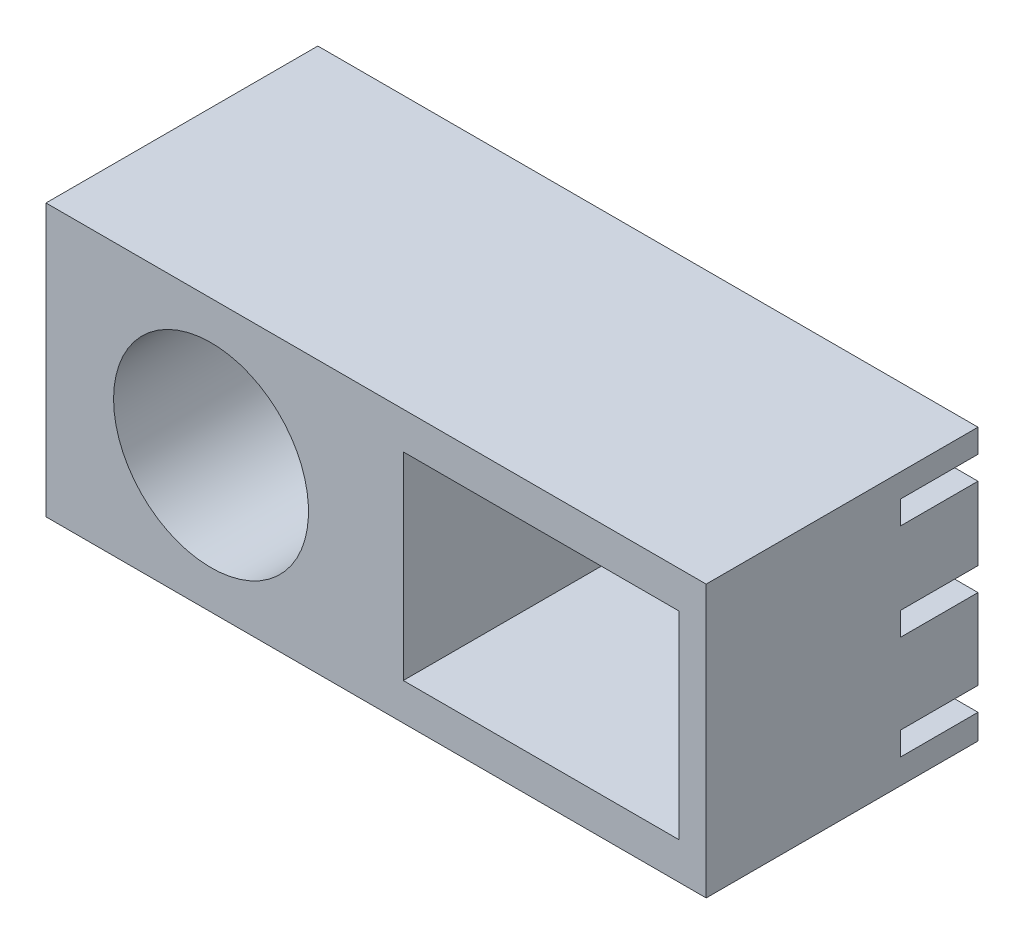
ISO-10303-21;
HEADER;
FILE_DESCRIPTION(('STEP AP214'),'2;1');
FILE_NAME('part.step','',(''),(''),'','','');
FILE_SCHEMA(('AUTOMOTIVE_DESIGN { 1 0 10303 214 1 1 1 1 }'));
ENDSEC;
DATA;
#1=APPLICATION_CONTEXT('core data for automotive mechanical design processes');
#2=APPLICATION_PROTOCOL_DEFINITION('international standard','automotive_design',2000,#1);
#3=PRODUCT_CONTEXT('',#1,'mechanical');
#4=PRODUCT('Part','Part','',(#3));
#5=PRODUCT_RELATED_PRODUCT_CATEGORY('part','',(#4));
#6=PRODUCT_DEFINITION_FORMATION('','',#4);
#7=PRODUCT_DEFINITION_CONTEXT('part definition',#1,'design');
#8=PRODUCT_DEFINITION('design','',#6,#7);
#9=PRODUCT_DEFINITION_SHAPE('','',#8);
#10=(LENGTH_UNIT() NAMED_UNIT(*) SI_UNIT(.MILLI.,.METRE.));
#11=(NAMED_UNIT(*) PLANE_ANGLE_UNIT() SI_UNIT($,.RADIAN.));
#12=(NAMED_UNIT(*) SI_UNIT($,.STERADIAN.) SOLID_ANGLE_UNIT());
#13=UNCERTAINTY_MEASURE_WITH_UNIT(LENGTH_MEASURE(1.E-05),#10,'distance_accuracy_value','');
#14=(GEOMETRIC_REPRESENTATION_CONTEXT(3) GLOBAL_UNCERTAINTY_ASSIGNED_CONTEXT((#13)) GLOBAL_UNIT_ASSIGNED_CONTEXT((#10,
#11,#12)) REPRESENTATION_CONTEXT('',''));
#15=CARTESIAN_POINT('',(0.,0.,0.));
#16=DIRECTION('',(0.,0.,1.));
#17=DIRECTION('',(1.,0.,0.));
#18=AXIS2_PLACEMENT_3D('',#15,#16,#17);
#19=CARTESIAN_POINT('',(0.,0.,0.));
#20=DIRECTION('',(0.,0.,1.));
#21=DIRECTION('',(1.,0.,0.));
#22=AXIS2_PLACEMENT_3D('',#19,#20,#21);
#23=PLANE('',#22);
#24=DIRECTION('',(0.,1.,0.));
#25=VECTOR('',#24,1.);
#26=CARTESIAN_POINT('',(12.9905665280665,0.684615384615384,0.));
#27=LINE('',#26,#25);
#28=CARTESIAN_POINT('',(12.9905665280665,3.64606894529499,0.));
#29=VERTEX_POINT('',#28);
#30=CARTESIAN_POINT('',(12.9905665280665,5.52928832269854,0.));
#31=VERTEX_POINT('',#30);
#32=EDGE_CURVE('E227',#29,#31,#27,.T.);
#33=ORIENTED_EDGE('',*,*,#32,.T.);
#34=DIRECTION('',(-1.,0.,0.));
#35=VECTOR('',#34,1.);
#36=CARTESIAN_POINT('',(12.9905665280665,5.52928832269854,0.));
#37=LINE('',#36,#35);
#38=CARTESIAN_POINT('',(13.6905665280665,5.52928832269854,0.));
#39=VERTEX_POINT('',#38);
#40=EDGE_CURVE('E210',#39,#31,#37,.T.);
#41=ORIENTED_EDGE('',*,*,#40,.F.);
#42=DIRECTION('',(0.,1.,0.));
#43=VECTOR('',#42,1.);
#44=CARTESIAN_POINT('',(13.6905665280665,6.73461538461538,0.));
#45=LINE('',#44,#43);
#46=CARTESIAN_POINT('',(13.6905665280665,3.64606894529499,0.));
#47=VERTEX_POINT('',#46);
#48=EDGE_CURVE('E549',#47,#39,#45,.T.);
#49=ORIENTED_EDGE('',*,*,#48,.F.);
#50=DIRECTION('',(1.,0.,0.));
#51=VECTOR('',#50,1.);
#52=CARTESIAN_POINT('',(12.9905665280665,3.64606894529499,0.));
#53=LINE('',#52,#51);
#54=EDGE_CURVE('E472',#29,#47,#53,.T.);
#55=ORIENTED_EDGE('',*,*,#54,.F.);
#56=EDGE_LOOP('',(#33,#41,#49,#55));
#57=FACE_BOUND('',#56,.T.);
#58=ADVANCED_FACE('F39',(#57),#23,.F.);
#59=CARTESIAN_POINT('',(12.9905665280665,0.976141344026505,0.));
#60=VERTEX_POINT('',#59);
#61=CARTESIAN_POINT('',(12.9905665280665,3.04606894529499,0.));
#62=VERTEX_POINT('',#61);
#63=EDGE_CURVE('E516',#60,#62,#27,.T.);
#64=ORIENTED_EDGE('',*,*,#63,.T.);
#65=DIRECTION('',(-1.,0.,0.));
#66=VECTOR('',#65,1.);
#67=CARTESIAN_POINT('',(12.9905665280665,3.04606894529499,0.));
#68=LINE('',#67,#66);
#69=CARTESIAN_POINT('',(13.6905665280665,3.04606894529499,0.));
#70=VERTEX_POINT('',#69);
#71=EDGE_CURVE('E462',#70,#62,#68,.T.);
#72=ORIENTED_EDGE('',*,*,#71,.F.);
#73=CARTESIAN_POINT('',(13.6905665280665,0.976141344026505,0.));
#74=VERTEX_POINT('',#73);
#75=EDGE_CURVE('E274',#74,#70,#45,.T.);
#76=ORIENTED_EDGE('',*,*,#75,.F.);
#77=DIRECTION('',(1.,0.,0.));
#78=VECTOR('',#77,1.);
#79=CARTESIAN_POINT('',(12.9905665280665,0.976141344026505,0.));
#80=LINE('',#79,#78);
#81=EDGE_CURVE('E419',#60,#74,#80,.T.);
#82=ORIENTED_EDGE('',*,*,#81,.F.);
#83=EDGE_LOOP('',(#64,#72,#76,#82));
#84=FACE_BOUND('',#83,.T.);
#85=ADVANCED_FACE('F332',(#84),#23,.F.);
#86=CARTESIAN_POINT('',(0.,0.,7.));
#87=DIRECTION('',(0.,0.,1.));
#88=DIRECTION('',(1.,0.,0.));
#89=AXIS2_PLACEMENT_3D('',#86,#87,#88);
#90=PLANE('',#89);
#91=CARTESIAN_POINT('',(0.940566528066546,3.23461538461538,7.));
#92=DIRECTION('',(0.,0.,-1.));
#93=DIRECTION('',(-1.,0.,0.));
#94=AXIS2_PLACEMENT_3D('',#91,#92,#93);
#95=CIRCLE('',#94,2.51);
#96=CARTESIAN_POINT('',(-1.56943347193345,3.23461538461538,7.));
#97=VERTEX_POINT('',#96);
#98=EDGE_CURVE('E243',#97,#97,#95,.T.);
#99=ORIENTED_EDGE('',*,*,#98,.T.);
#100=EDGE_LOOP('',(#99));
#101=FACE_BOUND('',#100,.T.);
#102=DIRECTION('',(0.,-1.,0.));
#103=VECTOR('',#102,1.);
#104=CARTESIAN_POINT('',(-3.30943347193346,6.73461538461538,7.));
#105=LINE('',#104,#103);
#106=CARTESIAN_POINT('',(-3.30943347193346,6.73461538461538,7.));
#107=VERTEX_POINT('',#106);
#108=CARTESIAN_POINT('',(-3.30943347193345,-0.265384615384616,7.));
#109=VERTEX_POINT('',#108);
#110=EDGE_CURVE('E248',#107,#109,#105,.T.);
#111=ORIENTED_EDGE('',*,*,#110,.T.);
#112=DIRECTION('',(1.,0.,0.));
#113=VECTOR('',#112,1.);
#114=CARTESIAN_POINT('',(-3.30943347193345,-0.265384615384616,7.));
#115=LINE('',#114,#113);
#116=CARTESIAN_POINT('',(13.6905665280665,-0.265384615384616,7.));
#117=VERTEX_POINT('',#116);
#118=EDGE_CURVE('E252',#109,#117,#115,.T.);
#119=ORIENTED_EDGE('',*,*,#118,.T.);
#120=DIRECTION('',(0.,1.,0.));
#121=VECTOR('',#120,1.);
#122=CARTESIAN_POINT('',(13.6905665280665,6.73461538461538,7.));
#123=LINE('',#122,#121);
#124=CARTESIAN_POINT('',(13.6905665280665,6.73461538461538,7.));
#125=VERTEX_POINT('',#124);
#126=EDGE_CURVE('E256',#117,#125,#123,.T.);
#127=ORIENTED_EDGE('',*,*,#126,.T.);
#128=DIRECTION('',(-1.,0.,0.));
#129=VECTOR('',#128,1.);
#130=CARTESIAN_POINT('',(-3.30943347193346,6.73461538461538,7.));
#131=LINE('',#130,#129);
#132=EDGE_CURVE('E259',#125,#107,#131,.T.);
#133=ORIENTED_EDGE('',*,*,#132,.T.);
#134=EDGE_LOOP('',(#111,#119,#127,#133));
#135=FACE_BOUND('',#134,.T.);
#136=DIRECTION('',(0.,1.,0.));
#137=VECTOR('',#136,1.);
#138=CARTESIAN_POINT('',(5.89056652806655,0.684615384615384,7.));
#139=LINE('',#138,#137);
#140=CARTESIAN_POINT('',(5.89056652806655,0.684615384615384,7.));
#141=VERTEX_POINT('',#140);
#142=CARTESIAN_POINT('',(5.89056652806655,5.78461538461538,7.));
#143=VERTEX_POINT('',#142);
#144=EDGE_CURVE('E515',#141,#143,#139,.T.);
#145=ORIENTED_EDGE('',*,*,#144,.T.);
#146=DIRECTION('',(-1.,0.,0.));
#147=VECTOR('',#146,1.);
#148=CARTESIAN_POINT('',(12.9905665280665,5.78461538461538,7.));
#149=LINE('',#148,#147);
#150=CARTESIAN_POINT('',(12.9905665280665,5.78461538461538,7.));
#151=VERTEX_POINT('',#150);
#152=EDGE_CURVE('E512',#151,#143,#149,.T.);
#153=ORIENTED_EDGE('',*,*,#152,.F.);
#154=DIRECTION('',(0.,1.,0.));
#155=VECTOR('',#154,1.);
#156=CARTESIAN_POINT('',(12.9905665280665,0.684615384615384,7.));
#157=LINE('',#156,#155);
#158=CARTESIAN_POINT('',(12.9905665280665,0.684615384615384,7.));
#159=VERTEX_POINT('',#158);
#160=EDGE_CURVE('E215',#159,#151,#157,.T.);
#161=ORIENTED_EDGE('',*,*,#160,.F.);
#162=DIRECTION('',(-1.,0.,0.));
#163=VECTOR('',#162,1.);
#164=CARTESIAN_POINT('',(12.9905665280665,0.684615384615384,7.));
#165=LINE('',#164,#163);
#166=EDGE_CURVE('E224',#159,#141,#165,.T.);
#167=ORIENTED_EDGE('',*,*,#166,.T.);
#168=EDGE_LOOP('',(#145,#153,#161,#167));
#169=FACE_BOUND('',#168,.T.);
#170=ADVANCED_FACE('F316',(#101,#135,#169),#90,.T.);
#171=DIRECTION('',(1.,0.,0.));
#172=VECTOR('',#171,1.);
#173=CARTESIAN_POINT('',(12.9905665280665,6.12928832269854,0.));
#174=LINE('',#173,#172);
#175=CARTESIAN_POINT('',(12.4905665280665,6.12928832269854,0.));
#176=VERTEX_POINT('',#175);
#177=CARTESIAN_POINT('',(13.6905665280665,6.12928832269854,0.));
#178=VERTEX_POINT('',#177);
#179=EDGE_CURVE('E444',#176,#178,#174,.T.);
#180=ORIENTED_EDGE('',*,*,#179,.F.);
#181=DIRECTION('',(0.,1.,0.));
#182=VECTOR('',#181,1.);
#183=CARTESIAN_POINT('',(12.4905665280665,6.12928832269854,0.));
#184=LINE('',#183,#182);
#185=CARTESIAN_POINT('',(12.4905665280665,5.78461538461538,0.));
#186=VERTEX_POINT('',#185);
#187=EDGE_CURVE('E201',#186,#176,#184,.T.);
#188=ORIENTED_EDGE('',*,*,#187,.F.);
#189=DIRECTION('',(-1.,0.,0.));
#190=VECTOR('',#189,1.);
#191=CARTESIAN_POINT('',(12.9905665280665,5.78461538461538,0.));
#192=LINE('',#191,#190);
#193=CARTESIAN_POINT('',(5.89056652806655,5.78461538461538,0.));
#194=VERTEX_POINT('',#193);
#195=EDGE_CURVE('E242',#186,#194,#192,.T.);
#196=ORIENTED_EDGE('',*,*,#195,.T.);
#197=DIRECTION('',(0.,1.,0.));
#198=VECTOR('',#197,1.);
#199=CARTESIAN_POINT('',(5.89056652806655,0.684615384615384,0.));
#200=LINE('',#199,#198);
#201=CARTESIAN_POINT('',(5.89056652806655,0.684615384615384,0.));
#202=VERTEX_POINT('',#201);
#203=EDGE_CURVE('E525',#202,#194,#200,.T.);
#204=ORIENTED_EDGE('',*,*,#203,.F.);
#205=DIRECTION('',(-1.,0.,0.));
#206=VECTOR('',#205,1.);
#207=CARTESIAN_POINT('',(12.9905665280665,0.684615384615384,0.));
#208=LINE('',#207,#206);
#209=CARTESIAN_POINT('',(12.4905665280665,0.684615384615384,0.));
#210=VERTEX_POINT('',#209);
#211=EDGE_CURVE('E528',#210,#202,#208,.T.);
#212=ORIENTED_EDGE('',*,*,#211,.F.);
#213=DIRECTION('',(0.,1.,0.));
#214=VECTOR('',#213,1.);
#215=CARTESIAN_POINT('',(12.4905665280665,0.376141344026505,0.));
#216=LINE('',#215,#214);
#217=CARTESIAN_POINT('',(12.4905665280665,0.376141344026505,0.));
#218=VERTEX_POINT('',#217);
#219=EDGE_CURVE('E427',#218,#210,#216,.T.);
#220=ORIENTED_EDGE('',*,*,#219,.F.);
#221=DIRECTION('',(-1.,0.,0.));
#222=VECTOR('',#221,1.);
#223=CARTESIAN_POINT('',(12.9905665280665,0.376141344026505,0.));
#224=LINE('',#223,#222);
#225=CARTESIAN_POINT('',(13.6905665280665,0.376141344026505,0.));
#226=VERTEX_POINT('',#225);
#227=EDGE_CURVE('E305',#226,#218,#224,.T.);
#228=ORIENTED_EDGE('',*,*,#227,.F.);
#229=CARTESIAN_POINT('',(13.6905665280665,-0.265384615384616,0.));
#230=VERTEX_POINT('',#229);
#231=EDGE_CURVE('E270',#230,#226,#45,.T.);
#232=ORIENTED_EDGE('',*,*,#231,.F.);
#233=DIRECTION('',(1.,0.,0.));
#234=VECTOR('',#233,1.);
#235=CARTESIAN_POINT('',(-3.30943347193345,-0.265384615384616,0.));
#236=LINE('',#235,#234);
#237=CARTESIAN_POINT('',(-3.30943347193345,-0.265384615384616,0.));
#238=VERTEX_POINT('',#237);
#239=EDGE_CURVE('E266',#238,#230,#236,.T.);
#240=ORIENTED_EDGE('',*,*,#239,.F.);
#241=DIRECTION('',(0.,-1.,0.));
#242=VECTOR('',#241,1.);
#243=CARTESIAN_POINT('',(-3.30943347193346,6.73461538461538,0.));
#244=LINE('',#243,#242);
#245=CARTESIAN_POINT('',(-3.30943347193346,6.73461538461538,0.));
#246=VERTEX_POINT('',#245);
#247=EDGE_CURVE('E237',#246,#238,#244,.T.);
#248=ORIENTED_EDGE('',*,*,#247,.F.);
#249=DIRECTION('',(-1.,0.,0.));
#250=VECTOR('',#249,1.);
#251=CARTESIAN_POINT('',(-3.30943347193346,6.73461538461538,0.));
#252=LINE('',#251,#250);
#253=CARTESIAN_POINT('',(13.6905665280665,6.73461538461538,0.));
#254=VERTEX_POINT('',#253);
#255=EDGE_CURVE('E253',#254,#246,#252,.T.);
#256=ORIENTED_EDGE('',*,*,#255,.F.);
#257=EDGE_CURVE('E269',#178,#254,#45,.T.);
#258=ORIENTED_EDGE('',*,*,#257,.F.);
#259=EDGE_LOOP('',(#180,#188,#196,#204,#212,#220,#228,#232,#240,#248,#256,#258));
#260=FACE_BOUND('',#259,.T.);
#261=CARTESIAN_POINT('',(0.940566528066546,3.23461538461538,0.));
#262=DIRECTION('',(0.,0.,-1.));
#263=DIRECTION('',(-1.,0.,0.));
#264=AXIS2_PLACEMENT_3D('',#261,#262,#263);
#265=CIRCLE('',#264,2.51);
#266=CARTESIAN_POINT('',(-1.56943347193345,3.23461538461538,0.));
#267=VERTEX_POINT('',#266);
#268=EDGE_CURVE('E238',#267,#267,#265,.T.);
#269=ORIENTED_EDGE('',*,*,#268,.F.);
#270=EDGE_LOOP('',(#269));
#271=FACE_BOUND('',#270,.T.);
#272=ADVANCED_FACE('F299',(#260,#271),#23,.F.);
#273=CARTESIAN_POINT('',(-3.30943347193346,6.73461538461538,7.));
#274=DIRECTION('',(1.,0.,0.));
#275=DIRECTION('',(0.,1.,0.));
#276=AXIS2_PLACEMENT_3D('',#273,#274,#275);
#277=PLANE('',#276);
#278=ORIENTED_EDGE('',*,*,#247,.T.);
#279=DIRECTION('',(0.,0.,-1.));
#280=VECTOR('',#279,1.);
#281=CARTESIAN_POINT('',(-3.30943347193345,-0.265384615384616,7.));
#282=LINE('',#281,#280);
#283=EDGE_CURVE('E48',#109,#238,#282,.T.);
#284=ORIENTED_EDGE('',*,*,#283,.F.);
#285=ORIENTED_EDGE('',*,*,#110,.F.);
#286=DIRECTION('',(0.,0.,-1.));
#287=VECTOR('',#286,1.);
#288=CARTESIAN_POINT('',(-3.30943347193346,6.73461538461538,7.));
#289=LINE('',#288,#287);
#290=EDGE_CURVE('E262',#107,#246,#289,.T.);
#291=ORIENTED_EDGE('',*,*,#290,.T.);
#292=EDGE_LOOP('',(#278,#284,#285,#291));
#293=FACE_BOUND('',#292,.T.);
#294=ADVANCED_FACE('F41',(#293),#277,.F.);
#295=CARTESIAN_POINT('',(-3.30943347193345,-0.265384615384616,7.));
#296=DIRECTION('',(0.,1.,0.));
#297=DIRECTION('',(0.,0.,1.));
#298=AXIS2_PLACEMENT_3D('',#295,#296,#297);
#299=PLANE('',#298);
#300=ORIENTED_EDGE('',*,*,#239,.T.);
#301=DIRECTION('',(0.,0.,-1.));
#302=VECTOR('',#301,1.);
#303=CARTESIAN_POINT('',(13.6905665280665,-0.265384615384616,7.));
#304=LINE('',#303,#302);
#305=EDGE_CURVE('E284',#117,#230,#304,.T.);
#306=ORIENTED_EDGE('',*,*,#305,.F.);
#307=ORIENTED_EDGE('',*,*,#118,.F.);
#308=ORIENTED_EDGE('',*,*,#283,.T.);
#309=EDGE_LOOP('',(#300,#306,#307,#308));
#310=FACE_BOUND('',#309,.T.);
#311=ADVANCED_FACE('F291',(#310),#299,.F.);
#312=CARTESIAN_POINT('',(13.6905665280665,6.73461538461538,7.));
#313=DIRECTION('',(-1.,0.,0.));
#314=DIRECTION('',(0.,-1.,0.));
#315=AXIS2_PLACEMENT_3D('',#312,#313,#314);
#316=PLANE('',#315);
#317=ORIENTED_EDGE('',*,*,#48,.T.);
#318=DIRECTION('',(0.,0.,-1.));
#319=VECTOR('',#318,1.);
#320=CARTESIAN_POINT('',(13.6905665280665,5.52928832269854,2.));
#321=LINE('',#320,#319);
#322=CARTESIAN_POINT('',(13.6905665280665,5.52928832269854,2.));
#323=VERTEX_POINT('',#322);
#324=EDGE_CURVE('E452',#323,#39,#321,.T.);
#325=ORIENTED_EDGE('',*,*,#324,.F.);
#326=DIRECTION('',(0.,-1.,0.));
#327=VECTOR('',#326,1.);
#328=CARTESIAN_POINT('',(13.6905665280665,5.52928832269854,2.));
#329=LINE('',#328,#327);
#330=CARTESIAN_POINT('',(13.6905665280665,6.12928832269854,2.));
#331=VERTEX_POINT('',#330);
#332=EDGE_CURVE('E438',#331,#323,#329,.T.);
#333=ORIENTED_EDGE('',*,*,#332,.F.);
#334=DIRECTION('',(0.,0.,-1.));
#335=VECTOR('',#334,1.);
#336=CARTESIAN_POINT('',(13.6905665280665,6.12928832269854,2.));
#337=LINE('',#336,#335);
#338=EDGE_CURVE('E443',#331,#178,#337,.T.);
#339=ORIENTED_EDGE('',*,*,#338,.T.);
#340=ORIENTED_EDGE('',*,*,#257,.T.);
#341=DIRECTION('',(0.,0.,-1.));
#342=VECTOR('',#341,1.);
#343=CARTESIAN_POINT('',(13.6905665280665,6.73461538461538,7.));
#344=LINE('',#343,#342);
#345=EDGE_CURVE('E280',#125,#254,#344,.T.);
#346=ORIENTED_EDGE('',*,*,#345,.F.);
#347=ORIENTED_EDGE('',*,*,#126,.F.);
#348=ORIENTED_EDGE('',*,*,#305,.T.);
#349=ORIENTED_EDGE('',*,*,#231,.T.);
#350=DIRECTION('',(0.,0.,-1.));
#351=VECTOR('',#350,1.);
#352=CARTESIAN_POINT('',(13.6905665280665,0.376141344026505,2.));
#353=LINE('',#352,#351);
#354=CARTESIAN_POINT('',(13.6905665280665,0.376141344026505,2.));
#355=VERTEX_POINT('',#354);
#356=EDGE_CURVE('E311',#355,#226,#353,.T.);
#357=ORIENTED_EDGE('',*,*,#356,.F.);
#358=DIRECTION('',(0.,-1.,0.));
#359=VECTOR('',#358,1.);
#360=CARTESIAN_POINT('',(13.6905665280665,0.976141344026505,2.));
#361=LINE('',#360,#359);
#362=CARTESIAN_POINT('',(13.6905665280665,0.976141344026505,2.));
#363=VERTEX_POINT('',#362);
#364=EDGE_CURVE('E493',#363,#355,#361,.T.);
#365=ORIENTED_EDGE('',*,*,#364,.F.);
#366=DIRECTION('',(0.,0.,-1.));
#367=VECTOR('',#366,1.);
#368=CARTESIAN_POINT('',(13.6905665280665,0.976141344026505,2.));
#369=LINE('',#368,#367);
#370=EDGE_CURVE('E506',#363,#74,#369,.T.);
#371=ORIENTED_EDGE('',*,*,#370,.T.);
#372=ORIENTED_EDGE('',*,*,#75,.T.);
#373=DIRECTION('',(0.,0.,-1.));
#374=VECTOR('',#373,1.);
#375=CARTESIAN_POINT('',(13.6905665280665,3.04606894529499,2.));
#376=LINE('',#375,#374);
#377=CARTESIAN_POINT('',(13.6905665280665,3.04606894529499,2.));
#378=VERTEX_POINT('',#377);
#379=EDGE_CURVE('E480',#378,#70,#376,.T.);
#380=ORIENTED_EDGE('',*,*,#379,.F.);
#381=DIRECTION('',(0.,-1.,0.));
#382=VECTOR('',#381,1.);
#383=CARTESIAN_POINT('',(13.6905665280665,3.64606894529499,2.));
#384=LINE('',#383,#382);
#385=CARTESIAN_POINT('',(13.6905665280665,3.64606894529499,2.));
#386=VERTEX_POINT('',#385);
#387=EDGE_CURVE('E466',#386,#378,#384,.T.);
#388=ORIENTED_EDGE('',*,*,#387,.F.);
#389=DIRECTION('',(0.,0.,-1.));
#390=VECTOR('',#389,1.);
#391=CARTESIAN_POINT('',(13.6905665280665,3.64606894529499,2.));
#392=LINE('',#391,#390);
#393=EDGE_CURVE('E483',#386,#47,#392,.T.);
#394=ORIENTED_EDGE('',*,*,#393,.T.);
#395=EDGE_LOOP('',(#317,#325,#333,#339,#340,#346,#347,#348,#349,#357,#365,#371,#372,#380,#388,#394));
#396=FACE_BOUND('',#395,.T.);
#397=ADVANCED_FACE('F309',(#396),#316,.F.);
#398=CARTESIAN_POINT('',(-3.30943347193346,6.73461538461538,7.));
#399=DIRECTION('',(0.,-1.,0.));
#400=DIRECTION('',(0.,0.,-1.));
#401=AXIS2_PLACEMENT_3D('',#398,#399,#400);
#402=PLANE('',#401);
#403=ORIENTED_EDGE('',*,*,#255,.T.);
#404=ORIENTED_EDGE('',*,*,#290,.F.);
#405=ORIENTED_EDGE('',*,*,#132,.F.);
#406=ORIENTED_EDGE('',*,*,#345,.T.);
#407=EDGE_LOOP('',(#403,#404,#405,#406));
#408=FACE_BOUND('',#407,.T.);
#409=ADVANCED_FACE('F319',(#408),#402,.F.);
#410=CARTESIAN_POINT('',(0.940566528066546,3.23461538461538,7.));
#411=DIRECTION('',(0.,0.,-1.));
#412=DIRECTION('',(-1.,0.,0.));
#413=AXIS2_PLACEMENT_3D('',#410,#411,#412);
#414=CYLINDRICAL_SURFACE('',#413,2.51);
#415=ORIENTED_EDGE('',*,*,#98,.F.);
#416=EDGE_LOOP('',(#415));
#417=FACE_BOUND('',#416,.T.);
#418=ORIENTED_EDGE('',*,*,#268,.T.);
#419=EDGE_LOOP('',(#418));
#420=FACE_BOUND('',#419,.T.);
#421=ADVANCED_FACE('F321',(#417,#420),#414,.F.);
#422=CARTESIAN_POINT('',(12.9905665280665,5.78461538461538,7.));
#423=DIRECTION('',(0.,-1.,0.));
#424=DIRECTION('',(0.,0.,-1.));
#425=AXIS2_PLACEMENT_3D('',#422,#423,#424);
#426=PLANE('',#425);
#427=DIRECTION('',(0.,0.,-1.));
#428=VECTOR('',#427,1.);
#429=CARTESIAN_POINT('',(12.4905665280665,5.78461538461538,2.));
#430=LINE('',#429,#428);
#431=CARTESIAN_POINT('',(12.4905665280665,5.78461538461538,2.));
#432=VERTEX_POINT('',#431);
#433=EDGE_CURVE('E197',#432,#186,#430,.T.);
#434=ORIENTED_EDGE('',*,*,#433,.F.);
#435=DIRECTION('',(-1.,0.,0.));
#436=VECTOR('',#435,1.);
#437=CARTESIAN_POINT('',(12.9905665280665,5.78461538461538,2.));
#438=LINE('',#437,#436);
#439=CARTESIAN_POINT('',(12.9905665280665,5.78461538461538,2.));
#440=VERTEX_POINT('',#439);
#441=EDGE_CURVE('E191',#440,#432,#438,.T.);
#442=ORIENTED_EDGE('',*,*,#441,.F.);
#443=DIRECTION('',(0.,0.,-1.));
#444=VECTOR('',#443,1.);
#445=CARTESIAN_POINT('',(12.9905665280665,5.78461538461538,7.));
#446=LINE('',#445,#444);
#447=EDGE_CURVE('E194',#151,#440,#446,.T.);
#448=ORIENTED_EDGE('',*,*,#447,.F.);
#449=ORIENTED_EDGE('',*,*,#152,.T.);
#450=DIRECTION('',(0.,0.,-1.));
#451=VECTOR('',#450,1.);
#452=CARTESIAN_POINT('',(5.89056652806655,5.78461538461538,7.));
#453=LINE('',#452,#451);
#454=EDGE_CURVE('E233',#143,#194,#453,.T.);
#455=ORIENTED_EDGE('',*,*,#454,.T.);
#456=ORIENTED_EDGE('',*,*,#195,.F.);
#457=EDGE_LOOP('',(#434,#442,#448,#449,#455,#456));
#458=FACE_BOUND('',#457,.T.);
#459=ADVANCED_FACE('F192',(#458),#426,.T.);
#460=CARTESIAN_POINT('',(5.89056652806655,0.684615384615384,7.));
#461=DIRECTION('',(-1.,0.,0.));
#462=DIRECTION('',(0.,0.,1.));
#463=AXIS2_PLACEMENT_3D('',#460,#461,#462);
#464=PLANE('',#463);
#465=ORIENTED_EDGE('',*,*,#203,.T.);
#466=ORIENTED_EDGE('',*,*,#454,.F.);
#467=ORIENTED_EDGE('',*,*,#144,.F.);
#468=DIRECTION('',(0.,0.,-1.));
#469=VECTOR('',#468,1.);
#470=CARTESIAN_POINT('',(5.89056652806655,0.684615384615384,7.));
#471=LINE('',#470,#469);
#472=EDGE_CURVE('E222',#141,#202,#471,.T.);
#473=ORIENTED_EDGE('',*,*,#472,.T.);
#474=EDGE_LOOP('',(#465,#466,#467,#473));
#475=FACE_BOUND('',#474,.T.);
#476=ADVANCED_FACE('F351',(#475),#464,.F.);
#477=CARTESIAN_POINT('',(12.9905665280665,0.684615384615384,7.));
#478=DIRECTION('',(0.,-1.,0.));
#479=DIRECTION('',(0.,0.,-1.));
#480=AXIS2_PLACEMENT_3D('',#477,#478,#479);
#481=PLANE('',#480);
#482=DIRECTION('',(1.,0.,0.));
#483=VECTOR('',#482,1.);
#484=CARTESIAN_POINT('',(12.9905665280665,0.684615384615384,2.));
#485=LINE('',#484,#483);
#486=CARTESIAN_POINT('',(12.4905665280665,0.684615384615384,2.));
#487=VERTEX_POINT('',#486);
#488=CARTESIAN_POINT('',(12.9905665280665,0.684615384615384,2.));
#489=VERTEX_POINT('',#488);
#490=EDGE_CURVE('E426',#487,#489,#485,.T.);
#491=ORIENTED_EDGE('',*,*,#490,.F.);
#492=DIRECTION('',(0.,0.,-1.));
#493=VECTOR('',#492,1.);
#494=CARTESIAN_POINT('',(12.4905665280665,0.684615384615384,2.));
#495=LINE('',#494,#493);
#496=EDGE_CURVE('E409',#487,#210,#495,.T.);
#497=ORIENTED_EDGE('',*,*,#496,.T.);
#498=ORIENTED_EDGE('',*,*,#211,.T.);
#499=ORIENTED_EDGE('',*,*,#472,.F.);
#500=ORIENTED_EDGE('',*,*,#166,.F.);
#501=DIRECTION('',(0.,0.,-1.));
#502=VECTOR('',#501,1.);
#503=CARTESIAN_POINT('',(12.9905665280665,0.684615384615384,7.));
#504=LINE('',#503,#502);
#505=EDGE_CURVE('E217',#159,#489,#504,.T.);
#506=ORIENTED_EDGE('',*,*,#505,.T.);
#507=EDGE_LOOP('',(#491,#497,#498,#499,#500,#506));
#508=FACE_BOUND('',#507,.T.);
#509=ADVANCED_FACE('F354',(#508),#481,.F.);
#510=CARTESIAN_POINT('',(12.9905665280665,0.684615384615384,7.));
#511=DIRECTION('',(-1.,0.,0.));
#512=DIRECTION('',(0.,0.,1.));
#513=AXIS2_PLACEMENT_3D('',#510,#511,#512);
#514=PLANE('',#513);
#515=DIRECTION('',(0.,0.,-1.));
#516=VECTOR('',#515,1.);
#517=CARTESIAN_POINT('',(12.9905665280665,5.52928832269854,2.));
#518=LINE('',#517,#516);
#519=CARTESIAN_POINT('',(12.9905665280665,5.52928832269854,2.));
#520=VERTEX_POINT('',#519);
#521=EDGE_CURVE('E247',#520,#31,#518,.T.);
#522=ORIENTED_EDGE('',*,*,#521,.T.);
#523=ORIENTED_EDGE('',*,*,#32,.F.);
#524=DIRECTION('',(0.,0.,-1.));
#525=VECTOR('',#524,1.);
#526=CARTESIAN_POINT('',(12.9905665280665,3.64606894529499,2.));
#527=LINE('',#526,#525);
#528=CARTESIAN_POINT('',(12.9905665280665,3.64606894529499,2.));
#529=VERTEX_POINT('',#528);
#530=EDGE_CURVE('E471',#529,#29,#527,.T.);
#531=ORIENTED_EDGE('',*,*,#530,.F.);
#532=DIRECTION('',(0.,1.,0.));
#533=VECTOR('',#532,1.);
#534=CARTESIAN_POINT('',(12.9905665280665,3.64606894529499,2.));
#535=LINE('',#534,#533);
#536=CARTESIAN_POINT('',(12.9905665280665,3.04606894529499,2.));
#537=VERTEX_POINT('',#536);
#538=EDGE_CURVE('E458',#537,#529,#535,.T.);
#539=ORIENTED_EDGE('',*,*,#538,.F.);
#540=DIRECTION('',(0.,0.,-1.));
#541=VECTOR('',#540,1.);
#542=CARTESIAN_POINT('',(12.9905665280665,3.04606894529499,2.));
#543=LINE('',#542,#541);
#544=EDGE_CURVE('E447',#537,#62,#543,.T.);
#545=ORIENTED_EDGE('',*,*,#544,.T.);
#546=ORIENTED_EDGE('',*,*,#63,.F.);
#547=DIRECTION('',(0.,0.,-1.));
#548=VECTOR('',#547,1.);
#549=CARTESIAN_POINT('',(12.9905665280665,0.976141344026505,2.));
#550=LINE('',#549,#548);
#551=CARTESIAN_POINT('',(12.9905665280665,0.976141344026505,2.));
#552=VERTEX_POINT('',#551);
#553=EDGE_CURVE('E499',#552,#60,#550,.T.);
#554=ORIENTED_EDGE('',*,*,#553,.F.);
#555=DIRECTION('',(0.,1.,0.));
#556=VECTOR('',#555,1.);
#557=CARTESIAN_POINT('',(12.9905665280665,0.684615384615384,2.));
#558=LINE('',#557,#556);
#559=EDGE_CURVE('E11',#489,#552,#558,.T.);
#560=ORIENTED_EDGE('',*,*,#559,.F.);
#561=ORIENTED_EDGE('',*,*,#505,.F.);
#562=ORIENTED_EDGE('',*,*,#160,.T.);
#563=ORIENTED_EDGE('',*,*,#447,.T.);
#564=DIRECTION('',(0.,1.,0.));
#565=VECTOR('',#564,1.);
#566=CARTESIAN_POINT('',(12.9905665280665,5.52928832269854,2.));
#567=LINE('',#566,#565);
#568=EDGE_CURVE('E204',#520,#440,#567,.T.);
#569=ORIENTED_EDGE('',*,*,#568,.F.);
#570=EDGE_LOOP('',(#522,#523,#531,#539,#545,#546,#554,#560,#561,#562,#563,#569));
#571=FACE_BOUND('',#570,.T.);
#572=ADVANCED_FACE('F212',(#571),#514,.T.);
#573=CARTESIAN_POINT('',(12.9905665280665,0.376141344026505,2.));
#574=DIRECTION('',(0.,-1.,0.));
#575=DIRECTION('',(0.,0.,-1.));
#576=AXIS2_PLACEMENT_3D('',#573,#574,#575);
#577=PLANE('',#576);
#578=ORIENTED_EDGE('',*,*,#227,.T.);
#579=DIRECTION('',(0.,0.,-1.));
#580=VECTOR('',#579,1.);
#581=CARTESIAN_POINT('',(12.4905665280665,0.376141344026505,2.));
#582=LINE('',#581,#580);
#583=CARTESIAN_POINT('',(12.4905665280665,0.376141344026505,2.));
#584=VERTEX_POINT('',#583);
#585=EDGE_CURVE('E413',#584,#218,#582,.T.);
#586=ORIENTED_EDGE('',*,*,#585,.F.);
#587=DIRECTION('',(-1.,0.,0.));
#588=VECTOR('',#587,1.);
#589=CARTESIAN_POINT('',(12.9905665280665,0.376141344026505,2.));
#590=LINE('',#589,#588);
#591=EDGE_CURVE('E496',#355,#584,#590,.T.);
#592=ORIENTED_EDGE('',*,*,#591,.F.);
#593=ORIENTED_EDGE('',*,*,#356,.T.);
#594=EDGE_LOOP('',(#578,#586,#592,#593));
#595=FACE_BOUND('',#594,.T.);
#596=ADVANCED_FACE('F361',(#595),#577,.F.);
#597=CARTESIAN_POINT('',(12.9905665280665,0.976141344026505,2.));
#598=DIRECTION('',(0.,1.,0.));
#599=DIRECTION('',(0.,0.,1.));
#600=AXIS2_PLACEMENT_3D('',#597,#598,#599);
#601=PLANE('',#600);
#602=ORIENTED_EDGE('',*,*,#81,.T.);
#603=ORIENTED_EDGE('',*,*,#370,.F.);
#604=DIRECTION('',(1.,0.,0.));
#605=VECTOR('',#604,1.);
#606=CARTESIAN_POINT('',(12.9905665280665,0.976141344026505,2.));
#607=LINE('',#606,#605);
#608=EDGE_CURVE('E489',#552,#363,#607,.T.);
#609=ORIENTED_EDGE('',*,*,#608,.F.);
#610=ORIENTED_EDGE('',*,*,#553,.T.);
#611=EDGE_LOOP('',(#602,#603,#609,#610));
#612=FACE_BOUND('',#611,.T.);
#613=ADVANCED_FACE('F362',(#612),#601,.F.);
#614=CARTESIAN_POINT('',(0.,0.,2.));
#615=DIRECTION('',(0.,0.,1.));
#616=DIRECTION('',(1.,0.,0.));
#617=AXIS2_PLACEMENT_3D('',#614,#615,#616);
#618=PLANE('',#617);
#619=ORIENTED_EDGE('',*,*,#591,.T.);
#620=DIRECTION('',(0.,1.,0.));
#621=VECTOR('',#620,1.);
#622=CARTESIAN_POINT('',(12.4905665280665,0.376141344026505,2.));
#623=LINE('',#622,#621);
#624=EDGE_CURVE('E422',#584,#487,#623,.T.);
#625=ORIENTED_EDGE('',*,*,#624,.T.);
#626=ORIENTED_EDGE('',*,*,#490,.T.);
#627=ORIENTED_EDGE('',*,*,#559,.T.);
#628=ORIENTED_EDGE('',*,*,#608,.T.);
#629=ORIENTED_EDGE('',*,*,#364,.T.);
#630=EDGE_LOOP('',(#619,#625,#626,#627,#628,#629));
#631=FACE_BOUND('',#630,.T.);
#632=ADVANCED_FACE('F365',(#631),#618,.F.);
#633=CARTESIAN_POINT('',(12.9905665280665,3.04606894529499,2.));
#634=DIRECTION('',(0.,-1.,0.));
#635=DIRECTION('',(0.,0.,-1.));
#636=AXIS2_PLACEMENT_3D('',#633,#634,#635);
#637=PLANE('',#636);
#638=ORIENTED_EDGE('',*,*,#71,.T.);
#639=ORIENTED_EDGE('',*,*,#544,.F.);
#640=DIRECTION('',(-1.,0.,0.));
#641=VECTOR('',#640,1.);
#642=CARTESIAN_POINT('',(12.9905665280665,3.04606894529499,2.));
#643=LINE('',#642,#641);
#644=EDGE_CURVE('E63',#378,#537,#643,.T.);
#645=ORIENTED_EDGE('',*,*,#644,.F.);
#646=ORIENTED_EDGE('',*,*,#379,.T.);
#647=EDGE_LOOP('',(#638,#639,#645,#646));
#648=FACE_BOUND('',#647,.T.);
#649=ADVANCED_FACE('F372',(#648),#637,.F.);
#650=CARTESIAN_POINT('',(12.9905665280665,3.64606894529499,2.));
#651=DIRECTION('',(0.,1.,0.));
#652=DIRECTION('',(0.,0.,1.));
#653=AXIS2_PLACEMENT_3D('',#650,#651,#652);
#654=PLANE('',#653);
#655=ORIENTED_EDGE('',*,*,#54,.T.);
#656=ORIENTED_EDGE('',*,*,#393,.F.);
#657=DIRECTION('',(1.,0.,0.));
#658=VECTOR('',#657,1.);
#659=CARTESIAN_POINT('',(12.9905665280665,3.64606894529499,2.));
#660=LINE('',#659,#658);
#661=EDGE_CURVE('E461',#529,#386,#660,.T.);
#662=ORIENTED_EDGE('',*,*,#661,.F.);
#663=ORIENTED_EDGE('',*,*,#530,.T.);
#664=EDGE_LOOP('',(#655,#656,#662,#663));
#665=FACE_BOUND('',#664,.T.);
#666=ADVANCED_FACE('F374',(#665),#654,.F.);
#667=CARTESIAN_POINT('',(0.,0.,2.));
#668=DIRECTION('',(0.,0.,1.));
#669=DIRECTION('',(1.,0.,0.));
#670=AXIS2_PLACEMENT_3D('',#667,#668,#669);
#671=PLANE('',#670);
#672=ORIENTED_EDGE('',*,*,#538,.T.);
#673=ORIENTED_EDGE('',*,*,#661,.T.);
#674=ORIENTED_EDGE('',*,*,#387,.T.);
#675=ORIENTED_EDGE('',*,*,#644,.T.);
#676=EDGE_LOOP('',(#672,#673,#674,#675));
#677=FACE_BOUND('',#676,.T.);
#678=ADVANCED_FACE('F377',(#677),#671,.F.);
#679=CARTESIAN_POINT('',(12.9905665280665,5.52928832269854,2.));
#680=DIRECTION('',(0.,-1.,0.));
#681=DIRECTION('',(0.,0.,-1.));
#682=AXIS2_PLACEMENT_3D('',#679,#680,#681);
#683=PLANE('',#682);
#684=ORIENTED_EDGE('',*,*,#40,.T.);
#685=ORIENTED_EDGE('',*,*,#521,.F.);
#686=DIRECTION('',(-1.,0.,0.));
#687=VECTOR('',#686,1.);
#688=CARTESIAN_POINT('',(12.9905665280665,5.52928832269854,2.));
#689=LINE('',#688,#687);
#690=EDGE_CURVE('E55',#323,#520,#689,.T.);
#691=ORIENTED_EDGE('',*,*,#690,.F.);
#692=ORIENTED_EDGE('',*,*,#324,.T.);
#693=EDGE_LOOP('',(#684,#685,#691,#692));
#694=FACE_BOUND('',#693,.T.);
#695=ADVANCED_FACE('F384',(#694),#683,.F.);
#696=CARTESIAN_POINT('',(12.9905665280665,6.12928832269854,2.));
#697=DIRECTION('',(0.,1.,0.));
#698=DIRECTION('',(0.,0.,1.));
#699=AXIS2_PLACEMENT_3D('',#696,#697,#698);
#700=PLANE('',#699);
#701=ORIENTED_EDGE('',*,*,#179,.T.);
#702=ORIENTED_EDGE('',*,*,#338,.F.);
#703=DIRECTION('',(1.,0.,0.));
#704=VECTOR('',#703,1.);
#705=CARTESIAN_POINT('',(12.9905665280665,6.12928832269854,2.));
#706=LINE('',#705,#704);
#707=CARTESIAN_POINT('',(12.4905665280665,6.12928832269854,2.));
#708=VERTEX_POINT('',#707);
#709=EDGE_CURVE('E209',#708,#331,#706,.T.);
#710=ORIENTED_EDGE('',*,*,#709,.F.);
#711=DIRECTION('',(0.,0.,-1.));
#712=VECTOR('',#711,1.);
#713=CARTESIAN_POINT('',(12.4905665280665,6.12928832269854,2.));
#714=LINE('',#713,#712);
#715=EDGE_CURVE('E407',#708,#176,#714,.T.);
#716=ORIENTED_EDGE('',*,*,#715,.T.);
#717=EDGE_LOOP('',(#701,#702,#710,#716));
#718=FACE_BOUND('',#717,.T.);
#719=ADVANCED_FACE('F385',(#718),#700,.F.);
#720=CARTESIAN_POINT('',(0.,0.,2.));
#721=DIRECTION('',(0.,0.,-1.));
#722=DIRECTION('',(-1.,0.,0.));
#723=AXIS2_PLACEMENT_3D('',#720,#721,#722);
#724=PLANE('',#723);
#725=ORIENTED_EDGE('',*,*,#568,.T.);
#726=ORIENTED_EDGE('',*,*,#441,.T.);
#727=DIRECTION('',(0.,1.,0.));
#728=VECTOR('',#727,1.);
#729=CARTESIAN_POINT('',(12.4905665280665,6.12928832269854,2.));
#730=LINE('',#729,#728);
#731=EDGE_CURVE('E200',#432,#708,#730,.T.);
#732=ORIENTED_EDGE('',*,*,#731,.T.);
#733=ORIENTED_EDGE('',*,*,#709,.T.);
#734=ORIENTED_EDGE('',*,*,#332,.T.);
#735=ORIENTED_EDGE('',*,*,#690,.T.);
#736=EDGE_LOOP('',(#725,#726,#732,#733,#734,#735));
#737=FACE_BOUND('',#736,.T.);
#738=ADVANCED_FACE('F205',(#737),#724,.T.);
#739=CARTESIAN_POINT('',(12.4905665280665,6.12928832269854,2.));
#740=DIRECTION('',(-1.,0.,0.));
#741=DIRECTION('',(0.,0.,1.));
#742=AXIS2_PLACEMENT_3D('',#739,#740,#741);
#743=PLANE('',#742);
#744=ORIENTED_EDGE('',*,*,#187,.T.);
#745=ORIENTED_EDGE('',*,*,#715,.F.);
#746=ORIENTED_EDGE('',*,*,#731,.F.);
#747=ORIENTED_EDGE('',*,*,#433,.T.);
#748=EDGE_LOOP('',(#744,#745,#746,#747));
#749=FACE_BOUND('',#748,.T.);
#750=ADVANCED_FACE('F394',(#749),#743,.F.);
#751=CARTESIAN_POINT('',(12.4905665280665,0.376141344026505,2.));
#752=DIRECTION('',(-1.,0.,0.));
#753=DIRECTION('',(0.,0.,1.));
#754=AXIS2_PLACEMENT_3D('',#751,#752,#753);
#755=PLANE('',#754);
#756=ORIENTED_EDGE('',*,*,#219,.T.);
#757=ORIENTED_EDGE('',*,*,#496,.F.);
#758=ORIENTED_EDGE('',*,*,#624,.F.);
#759=ORIENTED_EDGE('',*,*,#585,.T.);
#760=EDGE_LOOP('',(#756,#757,#758,#759));
#761=FACE_BOUND('',#760,.T.);
#762=ADVANCED_FACE('F395',(#761),#755,.F.);
#763=CLOSED_SHELL('',(#58,#85,#170,#272,#294,#311,#397,#409,#421,#459,#476,#509,#572,#596,#613,
#632,#649,#666,#678,#695,#719,#738,#750,#762));
#764=MANIFOLD_SOLID_BREP('B2',#763);
#765=ADVANCED_BREP_SHAPE_REPRESENTATION('',(#18,#764),#14);
#766=SHAPE_DEFINITION_REPRESENTATION(#9,#765);
ENDSEC;
END-ISO-10303-21;
